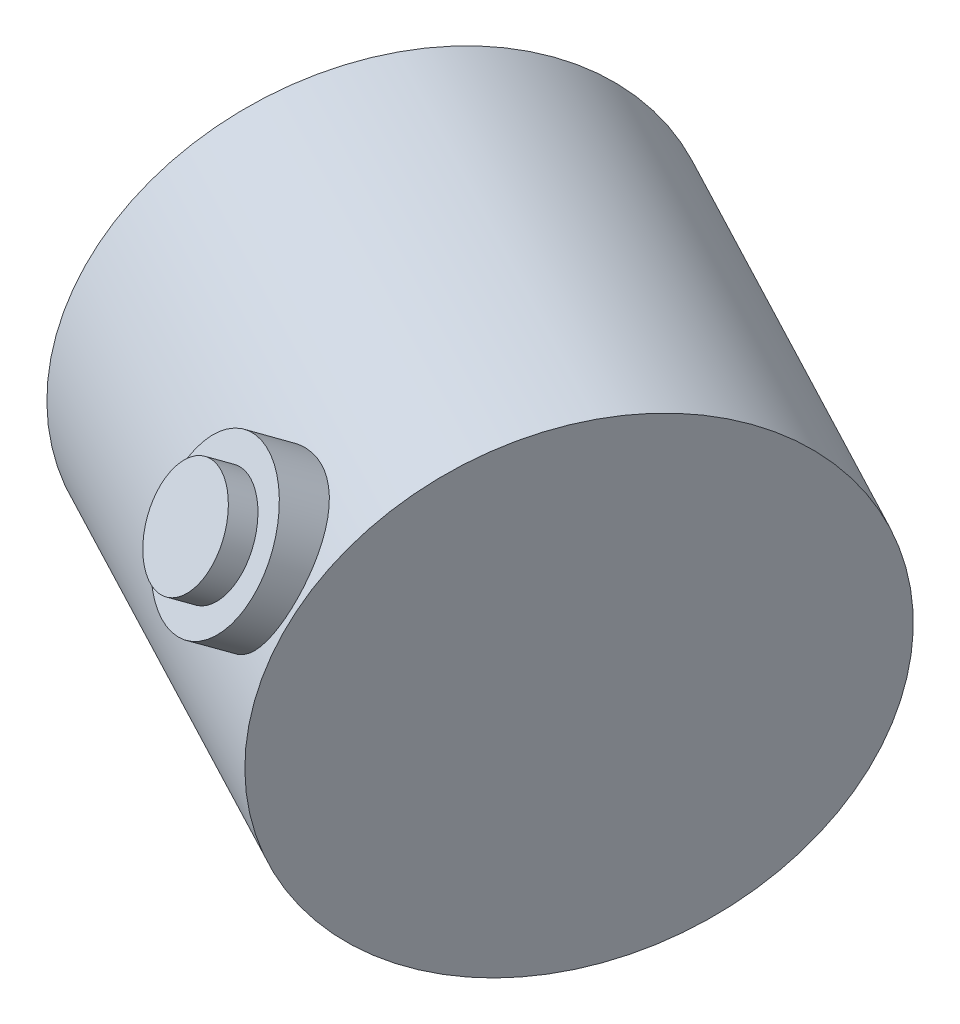
ISO-10303-21;
HEADER;
FILE_DESCRIPTION(('STEP AP214'),'2;1');
FILE_NAME('part.step','',(''),(''),'','','');
FILE_SCHEMA(('AUTOMOTIVE_DESIGN { 1 0 10303 214 1 1 1 1 }'));
ENDSEC;
DATA;
#1=APPLICATION_CONTEXT('core data for automotive mechanical design processes');
#2=APPLICATION_PROTOCOL_DEFINITION('international standard','automotive_design',2000,#1);
#3=PRODUCT_CONTEXT('',#1,'mechanical');
#4=PRODUCT('Part','Part','',(#3));
#5=PRODUCT_RELATED_PRODUCT_CATEGORY('part','',(#4));
#6=PRODUCT_DEFINITION_FORMATION('','',#4);
#7=PRODUCT_DEFINITION_CONTEXT('part definition',#1,'design');
#8=PRODUCT_DEFINITION('design','',#6,#7);
#9=PRODUCT_DEFINITION_SHAPE('','',#8);
#10=(LENGTH_UNIT() NAMED_UNIT(*) SI_UNIT(.MILLI.,.METRE.));
#11=(NAMED_UNIT(*) PLANE_ANGLE_UNIT() SI_UNIT($,.RADIAN.));
#12=(NAMED_UNIT(*) SI_UNIT($,.STERADIAN.) SOLID_ANGLE_UNIT());
#13=UNCERTAINTY_MEASURE_WITH_UNIT(LENGTH_MEASURE(1.E-05),#10,'distance_accuracy_value','');
#14=(GEOMETRIC_REPRESENTATION_CONTEXT(3) GLOBAL_UNCERTAINTY_ASSIGNED_CONTEXT((#13)) GLOBAL_UNIT_ASSIGNED_CONTEXT((#10,
#11,#12)) REPRESENTATION_CONTEXT('',''));
#15=CARTESIAN_POINT('',(0.,0.,0.));
#16=DIRECTION('',(0.,0.,1.));
#17=DIRECTION('',(1.,0.,0.));
#18=AXIS2_PLACEMENT_3D('',#15,#16,#17);
#19=CARTESIAN_POINT('',(51.9242983948159,113.432405259363,22.5851314132206));
#20=DIRECTION('',(-0.351191825080246,0.49477611999097,0.794896781402144));
#21=DIRECTION('',(0.815460169920325,0.5788131920348,0.));
#22=AXIS2_PLACEMENT_3D('',#19,#20,#21);
#23=PLANE('',#22);
#24=CARTESIAN_POINT('',(51.9242983948159,113.432405259363,22.5851314132206));
#25=DIRECTION('',(-0.351191825080246,0.494776119990969,0.794896781402144));
#26=DIRECTION('',(0.271168006367878,0.866336498762443,-0.419438890941818));
#27=AXIS2_PLACEMENT_3D('',#24,#25,#26);
#28=CIRCLE('',#27,4.);
#29=CARTESIAN_POINT('',(53.0089704202874,116.897751254413,20.9073758494534));
#30=VERTEX_POINT('',#29);
#31=EDGE_CURVE('E140',#30,#30,#28,.T.);
#32=ORIENTED_EDGE('',*,*,#31,.T.);
#33=EDGE_LOOP('',(#32));
#34=FACE_BOUND('',#33,.T.);
#35=ADVANCED_FACE('F17',(#34),#23,.T.);
#36=CARTESIAN_POINT('',(52.6266820449764,112.442853019381,20.9953378504164));
#37=DIRECTION('',(0.351191825080246,-0.49477611999097,-0.794896781402144));
#38=DIRECTION('',(0.,-0.848973388606735,0.52843560197776));
#39=AXIS2_PLACEMENT_3D('',#36,#37,#38);
#40=PLANE('',#39);
#41=CARTESIAN_POINT('',(52.6266820449764,112.442853019381,20.9953378504164));
#42=DIRECTION('',(-0.351191825080246,0.494776119990969,0.794896781402144));
#43=DIRECTION('',(0.271168006367878,0.866336498762443,-0.419438890941818));
#44=AXIS2_PLACEMENT_3D('',#41,#42,#43);
#45=CIRCLE('',#44,4.);
#46=CARTESIAN_POINT('',(53.7113540704479,115.908199014431,19.3175822866491));
#47=VERTEX_POINT('',#46);
#48=EDGE_CURVE('E137',#47,#47,#45,.T.);
#49=ORIENTED_EDGE('',*,*,#48,.F.);
#50=EDGE_LOOP('',(#49));
#51=FACE_BOUND('',#50,.T.);
#52=CARTESIAN_POINT('',(52.6266820449764,112.442853019381,20.9953378504164));
#53=DIRECTION('',(0.351191825080246,-0.494776119990969,-0.794896781402144));
#54=DIRECTION('',(-0.271168006367878,-0.866336498762443,0.419438890941818));
#55=AXIS2_PLACEMENT_3D('',#52,#53,#54);
#56=CIRCLE('',#55,6.);
#57=CARTESIAN_POINT('',(50.9996740067691,107.244834026807,23.5119711960673));
#58=VERTEX_POINT('',#57);
#59=EDGE_CURVE('E144',#58,#58,#56,.T.);
#60=ORIENTED_EDGE('',*,*,#59,.F.);
#61=EDGE_LOOP('',(#60));
#62=FACE_BOUND('',#61,.T.);
#63=ADVANCED_FACE('F334',(#51,#62),#40,.F.);
#64=CARTESIAN_POINT('',(37.0523147174565,103.332202091981,-7.89125284538117));
#65=DIRECTION('',(-0.896176441510976,0.0682470658615711,-0.438417750190398));
#66=DIRECTION('',(-0.439442331545378,0.,0.898270803959453));
#67=AXIS2_PLACEMENT_3D('',#64,#65,#66);
#68=PLANE('',#67);
#69=CARTESIAN_POINT('',(37.0523147174565,103.332202091981,-7.89125284538117));
#70=DIRECTION('',(-0.896176441510976,0.0682470658615709,-0.438417750190398));
#71=DIRECTION('',(0.271168006367878,0.866336498762443,-0.419438890941818));
#72=AXIS2_PLACEMENT_3D('',#69,#70,#71);
#73=CIRCLE('',#72,3.);
#74=CARTESIAN_POINT('',(36.2388106983528,100.733192595693,-6.63293617255571));
#75=VERTEX_POINT('',#74);
#76=EDGE_CURVE('E170',#75,#75,#73,.T.);
#77=ORIENTED_EDGE('',*,*,#76,.T.);
#78=EDGE_LOOP('',(#77));
#79=FACE_BOUND('',#78,.T.);
#80=ADVANCED_FACE('F336',(#79),#68,.T.);
#81=CARTESIAN_POINT('',(34.7771475049602,90.200660478821,-0.722833980873106));
#82=DIRECTION('',(-0.896176441510976,0.0682470658615711,-0.438417750190398));
#83=DIRECTION('',(-0.439442331545378,0.,0.898270803959453));
#84=AXIS2_PLACEMENT_3D('',#81,#82,#83);
#85=PLANE('',#84);
#86=CARTESIAN_POINT('',(34.7771475049602,90.200660478821,-0.722833980873106));
#87=DIRECTION('',(-0.896176441510976,0.0682470658615709,-0.438417750190398));
#88=DIRECTION('',(0.271168006367878,0.866336498762443,-0.419438890941818));
#89=AXIS2_PLACEMENT_3D('',#86,#87,#88);
#90=CIRCLE('',#89,1.5);
#91=CARTESIAN_POINT('',(34.3703954954084,88.9011557306774,-0.0936756444603783));
#92=VERTEX_POINT('',#91);
#93=EDGE_CURVE('E151',#92,#92,#90,.T.);
#94=ORIENTED_EDGE('',*,*,#93,.T.);
#95=EDGE_LOOP('',(#94));
#96=FACE_BOUND('',#95,.T.);
#97=ADVANCED_FACE('F331',(#96),#85,.T.);
#98=CARTESIAN_POINT('',(39.733304645499,118.160570102499,-6.50136250784601));
#99=DIRECTION('',(-0.896176441510976,0.0682470658615711,-0.438417750190398));
#100=DIRECTION('',(-0.439442331545378,0.,0.898270803959453));
#101=AXIS2_PLACEMENT_3D('',#98,#99,#100);
#102=PLANE('',#101);
#103=CARTESIAN_POINT('',(39.733304645499,118.160570102499,-6.50136250784601));
#104=DIRECTION('',(-0.896176441510976,0.0682470658615709,-0.438417750190398));
#105=DIRECTION('',(0.271168006367878,0.866336498762443,-0.419438890941818));
#106=AXIS2_PLACEMENT_3D('',#103,#104,#105);
#107=CIRCLE('',#106,1.5);
#108=CARTESIAN_POINT('',(39.3265526359472,116.861065354355,-5.87220417143328));
#109=VERTEX_POINT('',#108);
#110=EDGE_CURVE('E148',#109,#109,#107,.T.);
#111=ORIENTED_EDGE('',*,*,#110,.T.);
#112=EDGE_LOOP('',(#111));
#113=FACE_BOUND('',#112,.T.);
#114=ADVANCED_FACE('F326',(#113),#102,.T.);
#115=CARTESIAN_POINT('',(36.3163120164237,116.120562037447,0.165803064147189));
#116=DIRECTION('',(-0.896176441510976,0.0682470658615711,-0.438417750190398));
#117=DIRECTION('',(-0.439442331545378,0.,0.898270803959453));
#118=AXIS2_PLACEMENT_3D('',#115,#116,#117);
#119=PLANE('',#118);
#120=CARTESIAN_POINT('',(36.3163120164237,116.120562037447,0.165803064147189));
#121=DIRECTION('',(-0.896176441510976,0.0682470658615709,-0.438417750190398));
#122=DIRECTION('',(0.271168006367878,0.866336498762443,-0.419438890941818));
#123=AXIS2_PLACEMENT_3D('',#120,#121,#122);
#124=CIRCLE('',#123,1.5);
#125=CARTESIAN_POINT('',(35.9095600068719,114.821057289303,0.794961400559919));
#126=VERTEX_POINT('',#125);
#127=EDGE_CURVE('E185',#126,#126,#124,.T.);
#128=ORIENTED_EDGE('',*,*,#127,.T.);
#129=EDGE_LOOP('',(#128));
#130=FACE_BOUND('',#129,.T.);
#131=ADVANCED_FACE('F324',(#130),#119,.T.);
#132=CARTESIAN_POINT('',(45.4405432800512,103.265901364505,-20.4862211182751));
#133=DIRECTION('',(-0.896176441510976,0.0682470658615711,-0.438417750190398));
#134=DIRECTION('',(-0.439442331545378,0.,0.898270803959453));
#135=AXIS2_PLACEMENT_3D('',#132,#133,#134);
#136=PLANE('',#135);
#137=CARTESIAN_POINT('',(45.4405432800512,103.265901364505,-20.4862211182751));
#138=DIRECTION('',(-0.896176441510976,0.0682470658615709,-0.438417750190398));
#139=DIRECTION('',(0.271168006367878,0.866336498762443,-0.419438890941818));
#140=AXIS2_PLACEMENT_3D('',#137,#138,#139);
#141=CIRCLE('',#140,1.5);
#142=CARTESIAN_POINT('',(45.0337912704994,101.966396616361,-19.8570627818624));
#143=VERTEX_POINT('',#142);
#144=EDGE_CURVE('E205',#143,#143,#141,.T.);
#145=ORIENTED_EDGE('',*,*,#144,.T.);
#146=EDGE_LOOP('',(#145));
#147=FACE_BOUND('',#146,.T.);
#148=ADVANCED_FACE('F310',(#147),#136,.T.);
#149=CARTESIAN_POINT('',(32.6881531792541,95.6524876178808,4.39597953887744));
#150=DIRECTION('',(-0.896176441510976,0.0682470658615711,-0.438417750190398));
#151=DIRECTION('',(-0.439442331545378,0.,0.898270803959453));
#152=AXIS2_PLACEMENT_3D('',#149,#150,#151);
#153=PLANE('',#152);
#154=CARTESIAN_POINT('',(32.6881531792541,95.6524876178808,4.39597953887744));
#155=DIRECTION('',(-0.896176441510976,0.0682470658615709,-0.438417750190398));
#156=DIRECTION('',(0.271168006367878,0.866336498762443,-0.419438890941818));
#157=AXIS2_PLACEMENT_3D('',#154,#155,#156);
#158=CIRCLE('',#157,1.5);
#159=CARTESIAN_POINT('',(32.2814011697023,94.3529828697371,5.02513787529017));
#160=VERTEX_POINT('',#159);
#161=EDGE_CURVE('E211',#160,#160,#158,.T.);
#162=ORIENTED_EDGE('',*,*,#161,.T.);
#163=EDGE_LOOP('',(#162));
#164=FACE_BOUND('',#163,.T.);
#165=ADVANCED_FACE('F302',(#164),#153,.T.);
#166=CARTESIAN_POINT('',(44.1125449766821,95.7740661603931,-18.9378690660325));
#167=DIRECTION('',(-0.896176441510976,0.0682470658615711,-0.438417750190398));
#168=DIRECTION('',(-0.439442331545378,0.,0.898270803959453));
#169=AXIS2_PLACEMENT_3D('',#166,#167,#168);
#170=PLANE('',#169);
#171=CARTESIAN_POINT('',(44.1125449766821,95.7740661603931,-18.9378690660325));
#172=DIRECTION('',(-0.896176441510976,0.0682470658615709,-0.438417750190398));
#173=DIRECTION('',(0.271168006367878,0.866336498762443,-0.419438890941818));
#174=AXIS2_PLACEMENT_3D('',#171,#172,#173);
#175=CIRCLE('',#174,1.5);
#176=CARTESIAN_POINT('',(43.7057929671303,94.4745614122495,-18.3087107296198));
#177=VERTEX_POINT('',#176);
#178=EDGE_CURVE('E195',#177,#177,#175,.T.);
#179=ORIENTED_EDGE('',*,*,#178,.T.);
#180=EDGE_LOOP('',(#179));
#181=FACE_BOUND('',#180,.T.);
#182=ADVANCED_FACE('F306',(#181),#170,.T.);
#183=CARTESIAN_POINT('',(31.6752560683906,103.74168448715,-10.5217593465236));
#184=DIRECTION('',(-0.896176441510976,0.0682470658615711,-0.438417750190398));
#185=DIRECTION('',(-0.439442331545378,0.,0.898270803959453));
#186=AXIS2_PLACEMENT_3D('',#183,#184,#185);
#187=PLANE('',#186);
#188=CARTESIAN_POINT('',(31.6752560683906,103.74168448715,-10.5217593465236));
#189=DIRECTION('',(-0.896176441510976,0.0682470658615709,-0.438417750190398));
#190=DIRECTION('',(0.271168006367878,0.866336498762443,-0.419438890941818));
#191=AXIS2_PLACEMENT_3D('',#188,#189,#190);
#192=CIRCLE('',#191,3.);
#193=CARTESIAN_POINT('',(30.861752049287,101.142674990863,-9.2634426736981));
#194=VERTEX_POINT('',#193);
#195=EDGE_CURVE('E153',#194,#194,#192,.T.);
#196=ORIENTED_EDGE('',*,*,#195,.F.);
#197=EDGE_LOOP('',(#196));
#198=FACE_BOUND('',#197,.T.);
#199=CARTESIAN_POINT('',(31.6752560683906,103.74168448715,-10.5217593465236));
#200=DIRECTION('',(-0.896176441510976,0.0682470658615708,-0.438417750190398));
#201=DIRECTION('',(0.271168006367878,0.866336498762443,-0.419438890941818));
#202=AXIS2_PLACEMENT_3D('',#199,#200,#201);
#203=CIRCLE('',#202,10.);
#204=CARTESIAN_POINT('',(34.3869361320694,112.405049474775,-14.7161482559417));
#205=VERTEX_POINT('',#204);
#206=EDGE_CURVE('E240',#205,#205,#203,.T.);
#207=ORIENTED_EDGE('',*,*,#206,.T.);
#208=EDGE_LOOP('',(#207));
#209=FACE_BOUND('',#208,.T.);
#210=ADVANCED_FACE('F314',(#198,#209),#187,.T.);
#211=CARTESIAN_POINT('',(66.1780490665632,101.11417245148,6.35732403580678));
#212=DIRECTION('',(-0.896176441510976,0.0682470658615711,-0.438417750190398));
#213=DIRECTION('',(-0.439442331545378,0.,0.898270803959453));
#214=AXIS2_PLACEMENT_3D('',#211,#212,#213);
#215=PLANE('',#214);
#216=CARTESIAN_POINT('',(66.1780490665632,101.11417245148,6.35732403580678));
#217=DIRECTION('',(-0.896176441510976,0.0682470658615708,-0.438417750190398));
#218=DIRECTION('',(0.271168006367878,0.866336498762443,-0.419438890941818));
#219=AXIS2_PLACEMENT_3D('',#216,#217,#218);
#220=CIRCLE('',#219,19.35);
#221=CARTESIAN_POINT('',(71.4251499897816,117.877783702533,-1.75881850391739));
#222=VERTEX_POINT('',#221);
#223=EDGE_CURVE('E239',#222,#222,#220,.T.);
#224=ORIENTED_EDGE('',*,*,#223,.F.);
#225=EDGE_LOOP('',(#224));
#226=FACE_BOUND('',#225,.T.);
#227=ADVANCED_FACE('F315',(#226),#215,.F.);
#228=CARTESIAN_POINT('',(36.1561382759455,103.400449157842,-8.32967059557157));
#229=DIRECTION('',(-0.896176441510976,0.0682470658615711,-0.438417750190398));
#230=DIRECTION('',(-0.439442331545378,0.,0.898270803959453));
#231=AXIS2_PLACEMENT_3D('',#228,#229,#230);
#232=PLANE('',#231);
#233=CARTESIAN_POINT('',(36.1561382759455,103.400449157842,-8.32967059557157));
#234=DIRECTION('',(-0.896176441510976,0.0682470658615708,-0.438417750190398));
#235=DIRECTION('',(0.271168006367878,0.866336498762443,-0.419438890941818));
#236=AXIS2_PLACEMENT_3D('',#233,#234,#235);
#237=CIRCLE('',#236,10.);
#238=CARTESIAN_POINT('',(38.8678183396243,112.063814145467,-12.5240595049897));
#239=VERTEX_POINT('',#238);
#240=EDGE_CURVE('E227',#239,#239,#237,.T.);
#241=ORIENTED_EDGE('',*,*,#240,.F.);
#242=EDGE_LOOP('',(#241));
#243=FACE_BOUND('',#242,.T.);
#244=CARTESIAN_POINT('',(41.4240156521492,95.9788073579779,-20.2531223166037));
#245=DIRECTION('',(-0.896176441510976,0.0682470658615709,-0.438417750190398));
#246=DIRECTION('',(0.271168006367878,0.866336498762443,-0.419438890941818));
#247=AXIS2_PLACEMENT_3D('',#244,#245,#246);
#248=CIRCLE('',#247,1.5);
#249=CARTESIAN_POINT('',(41.0172636425974,94.6793026098342,-19.623963980191));
#250=VERTEX_POINT('',#249);
#251=EDGE_CURVE('E189',#250,#250,#248,.T.);
#252=ORIENTED_EDGE('',*,*,#251,.F.);
#253=EDGE_LOOP('',(#252));
#254=FACE_BOUND('',#253,.T.);
#255=CARTESIAN_POINT('',(29.9996238547212,95.8572288154655,3.08072628830625));
#256=DIRECTION('',(-0.896176441510976,0.0682470658615709,-0.438417750190398));
#257=DIRECTION('',(0.271168006367878,0.866336498762443,-0.419438890941818));
#258=AXIS2_PLACEMENT_3D('',#255,#256,#257);
#259=CIRCLE('',#258,1.5);
#260=CARTESIAN_POINT('',(29.5928718451694,94.5577240673218,3.70988462471897));
#261=VERTEX_POINT('',#260);
#262=EDGE_CURVE('E221',#261,#261,#259,.T.);
#263=ORIENTED_EDGE('',*,*,#262,.F.);
#264=EDGE_LOOP('',(#263));
#265=FACE_BOUND('',#264,.T.);
#266=CARTESIAN_POINT('',(42.7520139555183,103.47064256209,-21.8014743688463));
#267=DIRECTION('',(-0.896176441510976,0.0682470658615709,-0.438417750190398));
#268=DIRECTION('',(0.271168006367878,0.866336498762443,-0.419438890941818));
#269=AXIS2_PLACEMENT_3D('',#266,#267,#268);
#270=CIRCLE('',#269,1.5);
#271=CARTESIAN_POINT('',(42.3452619459665,102.171137813946,-21.1723160324336));
#272=VERTEX_POINT('',#271);
#273=EDGE_CURVE('E208',#272,#272,#270,.T.);
#274=ORIENTED_EDGE('',*,*,#273,.F.);
#275=EDGE_LOOP('',(#274));
#276=FACE_BOUND('',#275,.T.);
#277=CARTESIAN_POINT('',(33.6277826918908,116.325303235032,-1.149450186424));
#278=DIRECTION('',(-0.896176441510976,0.0682470658615709,-0.438417750190398));
#279=DIRECTION('',(0.271168006367878,0.866336498762443,-0.419438890941818));
#280=AXIS2_PLACEMENT_3D('',#277,#278,#279);
#281=CIRCLE('',#280,1.5);
#282=CARTESIAN_POINT('',(33.221030682339,115.025798486888,-0.520291850011275));
#283=VERTEX_POINT('',#282);
#284=EDGE_CURVE('E196',#283,#283,#281,.T.);
#285=ORIENTED_EDGE('',*,*,#284,.F.);
#286=EDGE_LOOP('',(#285));
#287=FACE_BOUND('',#286,.T.);
#288=CARTESIAN_POINT('',(37.044775320966,118.365311300084,-7.8166157584172));
#289=DIRECTION('',(-0.896176441510976,0.0682470658615709,-0.438417750190398));
#290=DIRECTION('',(0.271168006367878,0.866336498762443,-0.419438890941818));
#291=AXIS2_PLACEMENT_3D('',#288,#289,#290);
#292=CIRCLE('',#291,1.5);
#293=CARTESIAN_POINT('',(36.6380233114142,117.06580655194,-7.18745742200448));
#294=VERTEX_POINT('',#293);
#295=EDGE_CURVE('E182',#294,#294,#292,.T.);
#296=ORIENTED_EDGE('',*,*,#295,.F.);
#297=EDGE_LOOP('',(#296));
#298=FACE_BOUND('',#297,.T.);
#299=CARTESIAN_POINT('',(32.0886181804273,90.4054016764057,-2.0380872314443));
#300=DIRECTION('',(-0.896176441510976,0.0682470658615709,-0.438417750190398));
#301=DIRECTION('',(0.271168006367878,0.866336498762443,-0.419438890941818));
#302=AXIS2_PLACEMENT_3D('',#299,#300,#301);
#303=CIRCLE('',#302,1.5);
#304=CARTESIAN_POINT('',(31.6818661708755,89.1058969282621,-1.40892889503157));
#305=VERTEX_POINT('',#304);
#306=EDGE_CURVE('E162',#305,#305,#303,.T.);
#307=ORIENTED_EDGE('',*,*,#306,.F.);
#308=EDGE_LOOP('',(#307));
#309=FACE_BOUND('',#308,.T.);
#310=CARTESIAN_POINT('',(36.1561382759455,103.400449157842,-8.32967059557157));
#311=DIRECTION('',(-0.896176441510976,0.0682470658615708,-0.438417750190398));
#312=DIRECTION('',(0.271168006367878,0.866336498762443,-0.419438890941818));
#313=AXIS2_PLACEMENT_3D('',#310,#311,#312);
#314=CIRCLE('',#313,19.35);
#315=CARTESIAN_POINT('',(41.4032391991639,120.164060408896,-16.4458131352957));
#316=VERTEX_POINT('',#315);
#317=EDGE_CURVE('E11',#316,#316,#314,.T.);
#318=ORIENTED_EDGE('',*,*,#317,.T.);
#319=EDGE_LOOP('',(#318));
#320=FACE_BOUND('',#319,.T.);
#321=ADVANCED_FACE('F296',(#243,#254,#265,#276,#287,#298,#309,#320),#232,.T.);
#322=CARTESIAN_POINT('',(36.1561382759455,103.400449157842,-8.32967059557157));
#323=DIRECTION('',(0.896176441510976,-0.0682470658615709,0.438417750190398));
#324=DIRECTION('',(-0.271168006367878,-0.866336498762443,0.419438890941818));
#325=AXIS2_PLACEMENT_3D('',#322,#323,#324);
#326=CYLINDRICAL_SURFACE('',#325,19.35);
#327=CARTESIAN_POINT('',(55.519292984447,115.857829104299,15.6141057273949));
#328=CARTESIAN_POINT('',(55.4356246935888,115.864203252426,15.5731738102623));
#329=CARTESIAN_POINT('',(55.3510991418492,115.869060452374,15.5337610836463));
#330=CARTESIAN_POINT('',(55.1792062117482,115.875760557276,15.4574089471055));
#331=CARTESIAN_POINT('',(55.0918150174966,115.877554312102,15.4205188208364));
#332=CARTESIAN_POINT('',(54.9143395649188,115.877944612245,15.3493909493824));
#333=CARTESIAN_POINT('',(54.8242345791071,115.876489911986,15.3152046520808));
#334=CARTESIAN_POINT('',(54.6414994360986,115.870210255495,15.2496666871016));
#335=CARTESIAN_POINT('',(54.5488518948998,115.865332210483,15.2183685787295));
#336=CARTESIAN_POINT('',(54.3612192876159,115.852040455315,15.1587949352181));
#337=CARTESIAN_POINT('',(54.2662204302345,115.843572024803,15.1305750585152));
#338=CARTESIAN_POINT('',(54.074094302557,115.822940136605,15.0773437019218));
#339=CARTESIAN_POINT('',(53.9769570943475,115.810720507992,15.0523898441669));
#340=CARTESIAN_POINT('',(53.7807797487187,115.782450813772,15.0058990738834));
#341=CARTESIAN_POINT('',(53.6817336916348,115.766343583378,14.9844220057333));
#342=CARTESIAN_POINT('',(53.4820015273152,115.730125026235,14.9450174994905));
#343=CARTESIAN_POINT('',(53.3813139994209,115.709955010338,14.9271508372152));
#344=CARTESIAN_POINT('',(53.2143662694648,115.67347713934,14.9010091156825));
#345=CARTESIAN_POINT('',(53.1480646145772,115.658194850123,14.8915401331637));
#346=CARTESIAN_POINT('',(53.0073048034219,115.624029179613,14.8733188086662));
#347=CARTESIAN_POINT('',(52.9328667023365,115.604934545389,14.8648053354929));
#348=CARTESIAN_POINT('',(52.7760701339849,115.562400006669,14.8490259972226));
#349=CARTESIAN_POINT('',(52.6937540652909,115.538712992938,14.8420051133404));
#350=CARTESIAN_POINT('',(52.5215105903549,115.486221689441,14.8298620903078));
#351=CARTESIAN_POINT('',(52.4316483975148,115.457142408966,14.8250012203943));
#352=CARTESIAN_POINT('',(52.2447389158094,115.393039809575,14.8178863335194));
#353=CARTESIAN_POINT('',(52.1477840321949,115.357716241296,14.815910591175));
#354=CARTESIAN_POINT('',(51.9472343707251,115.280268082731,14.8153525171296));
#355=CARTESIAN_POINT('',(51.8437622702437,115.237821787181,14.8170677446893));
#356=CARTESIAN_POINT('',(51.6870839461339,115.169700212077,14.8227184436484));
#357=CARTESIAN_POINT('',(51.6331570818597,115.145542227273,14.8252276534593));
#358=CARTESIAN_POINT('',(51.523943451738,115.095162088834,14.8314625852783));
#359=CARTESIAN_POINT('',(51.4686788560089,115.068896781897,14.8352293520276));
#360=CARTESIAN_POINT('',(51.3569109669383,115.014192045052,14.8440915378954));
#361=CARTESIAN_POINT('',(51.300432555058,114.985708628732,14.8492290618401));
#362=CARTESIAN_POINT('',(51.1863592220187,114.926481477683,14.8609785955631));
#363=CARTESIAN_POINT('',(51.12879165019,114.895693816396,14.8676348078026));
#364=CARTESIAN_POINT('',(51.0166401380834,114.833857403129,14.881951084134));
#365=CARTESIAN_POINT('',(50.9620233585274,114.802857874072,14.8895664292984));
#366=CARTESIAN_POINT('',(50.8553117010784,114.740450829303,14.9056392611445));
#367=CARTESIAN_POINT('',(50.803189718246,114.709081545351,14.9140657296599));
#368=CARTESIAN_POINT('',(50.6528717818978,114.616033698416,14.940088353098));
#369=CARTESIAN_POINT('',(50.5558981555589,114.552743693367,14.9590525531569));
#370=CARTESIAN_POINT('',(50.3716641212142,114.4260291849,14.9993480580837));
#371=CARTESIAN_POINT('',(50.284176291585,114.362863126367,15.0204556863204));
#372=CARTESIAN_POINT('',(50.1184919759844,114.237304435648,15.0642899089675));
#373=CARTESIAN_POINT('',(50.0400658184781,114.175143901488,15.0868130693768));
#374=CARTESIAN_POINT('',(49.8920396244548,114.052390046469,15.1327723470853));
#375=CARTESIAN_POINT('',(49.8222102849944,113.992004974724,15.1560266200245));
#376=CARTESIAN_POINT('',(49.6908757881271,113.873482513633,15.2027908561395));
#377=CARTESIAN_POINT('',(49.6291446052975,113.815532721663,15.2261418183059));
#378=CARTESIAN_POINT('',(49.5134819030128,113.702469926927,15.2725091090898));
#379=CARTESIAN_POINT('',(49.4593303236099,113.647526280578,15.2953894313851));
#380=CARTESIAN_POINT('',(49.3583186000501,113.540941463304,15.3402327291089));
#381=CARTESIAN_POINT('',(49.3112444606294,113.48945760285,15.3620883313938));
#382=CARTESIAN_POINT('',(49.2000771601118,113.363326508591,15.4160280174474));
#383=CARTESIAN_POINT('',(49.1370422936981,113.287945571865,15.4485878708693));
#384=CARTESIAN_POINT('',(49.0161664097145,113.135608454781,15.5152136749793));
#385=CARTESIAN_POINT('',(48.9582668373501,113.058687201874,15.5492534098755));
#386=CARTESIAN_POINT('',(48.8476691433844,112.903512207127,15.6186207792594));
#387=CARTESIAN_POINT('',(48.7949113622044,112.825290465469,15.6539248280979));
#388=CARTESIAN_POINT('',(48.6945698435033,112.667789980447,15.7256552839669));
#389=CARTESIAN_POINT('',(48.6469258407382,112.588539788525,15.7620600879674));
#390=CARTESIAN_POINT('',(48.556771469454,112.42923316113,15.8358129319199));
#391=CARTESIAN_POINT('',(48.5142004450259,112.349202080077,15.8731415859));
#392=CARTESIAN_POINT('',(48.4341344156437,112.188574263,15.9485678877097));
#393=CARTESIAN_POINT('',(48.3965786441664,112.10799974817,15.986648351505));
#394=CARTESIAN_POINT('',(48.3264710378674,111.946511190588,16.063404920022));
#395=CARTESIAN_POINT('',(48.2938585774859,111.865616363867,16.1020660772014));
#396=CARTESIAN_POINT('',(48.2335517295649,111.703699893169,16.1798138846353));
#397=CARTESIAN_POINT('',(48.2057971071192,111.622694581269,16.2188878230028));
#398=CARTESIAN_POINT('',(48.1547753741312,111.459691617583,16.29780798743));
#399=CARTESIAN_POINT('',(48.1315066812787,111.37769432658,16.3376539357031));
#400=CARTESIAN_POINT('',(48.0891918549509,111.211774863832,16.4186302275088));
#401=CARTESIAN_POINT('',(48.0702081108054,111.127841722847,16.4597706953738));
#402=CARTESIAN_POINT('',(48.0366716150364,110.958234813872,16.5433134568462));
#403=CARTESIAN_POINT('',(48.0221834599051,110.872552990201,16.5857253245662));
#404=CARTESIAN_POINT('',(47.997842498727,110.699647858533,16.6717771502333));
#405=CARTESIAN_POINT('',(47.9880563432698,110.612419582834,16.7154259780275));
#406=CARTESIAN_POINT('',(47.9733187068319,110.43663528301,16.8039052205099));
#407=CARTESIAN_POINT('',(47.9684357663067,110.348077538889,16.8487436288007));
#408=CARTESIAN_POINT('',(47.9636955634916,110.169864524968,16.9395475245729));
#409=CARTESIAN_POINT('',(47.9639085248642,110.080210958447,16.9855200280119));
#410=CARTESIAN_POINT('',(47.9695488942809,109.90004511171,17.0785084495722));
#411=CARTESIAN_POINT('',(47.9750480907473,109.809538014481,17.1255300174268));
#412=CARTESIAN_POINT('',(47.9914172972807,109.627941724892,17.220581962031));
#413=CARTESIAN_POINT('',(48.0023601307164,109.536861645474,17.2686173191045));
#414=CARTESIAN_POINT('',(48.0256468953692,109.382221234069,17.3506167188794));
#415=CARTESIAN_POINT('',(48.0366325612496,109.318444315256,17.3845648613305));
#416=CARTESIAN_POINT('',(48.0625005635652,109.185023733638,17.4559199324994));
#417=CARTESIAN_POINT('',(48.077663982416,109.115436382689,17.4933307340679));
#418=CARTESIAN_POINT('',(48.1126381035858,108.970765209561,17.571744037749));
#419=CARTESIAN_POINT('',(48.1327472562266,108.895761743752,17.6127616617165));
#420=CARTESIAN_POINT('',(48.1784342621261,108.740690144221,17.6984564822171));
#421=CARTESIAN_POINT('',(48.2043294963954,108.660725443902,17.7431518163872));
#422=CARTESIAN_POINT('',(48.2624514468769,108.496263660601,17.8362468169394));
#423=CARTESIAN_POINT('',(48.2950132758648,108.411895457345,17.884665178638));
#424=CARTESIAN_POINT('',(48.3673668663432,108.239264410638,17.9851994131746));
#425=CARTESIAN_POINT('',(48.4075102083447,108.151157953172,18.0373307299839));
#426=CARTESIAN_POINT('',(48.4959543393763,107.971793470293,18.1452250794458));
#427=CARTESIAN_POINT('',(48.5446218082007,107.880720844233,18.2009970145446));
#428=CARTESIAN_POINT('',(48.6232065663625,107.744535394567,18.2859606428464));
#429=CARTESIAN_POINT('',(48.6510123935869,107.698194858366,18.3151586548331));
#430=CARTESIAN_POINT('',(48.7090634304523,107.605086463684,18.3743815675059));
#431=CARTESIAN_POINT('',(48.7393568326026,107.558347603035,18.4044049529774));
#432=CARTESIAN_POINT('',(48.8027050136984,107.464264028077,18.4655778769392));
#433=CARTESIAN_POINT('',(48.83582043968,107.416960598039,18.4967280902684));
#434=CARTESIAN_POINT('',(48.9026046689095,107.325163423527,18.5580942051263));
#435=CARTESIAN_POINT('',(48.9362195023349,107.280628433191,18.5883071611612));
#436=CARTESIAN_POINT('',(49.0038197128822,107.194275801273,18.6477351831526));
#437=CARTESIAN_POINT('',(49.0377536704869,107.152417247876,18.6769492661931));
#438=CARTESIAN_POINT('',(49.1058058456067,107.071338110103,18.7343578073432));
#439=CARTESIAN_POINT('',(49.1398755847992,107.032076527276,18.7625519802494));
#440=CARTESIAN_POINT('',(49.2402073483302,106.920230376515,18.8440296771346));
#441=CARTESIAN_POINT('',(49.3081211417814,106.849103802249,18.8972988960093));
#442=CARTESIAN_POINT('',(49.4429032512453,106.716479202444,18.9995608349017));
#443=CARTESIAN_POINT('',(49.5094483526112,106.654661637454,19.048566571481));
#444=CARTESIAN_POINT('',(49.6403667042129,106.539889839503,19.1422828387137));
#445=CARTESIAN_POINT('',(49.7044569751103,106.486626584681,19.1870101822854));
#446=CARTESIAN_POINT('',(49.8294753562598,106.388210969991,19.2722167039196));
#447=CARTESIAN_POINT('',(49.890159365023,106.342761802173,19.3127115619127));
#448=CARTESIAN_POINT('',(50.0075187040338,106.25922997023,19.3895307893821));
#449=CARTESIAN_POINT('',(50.0639861532639,106.220865553907,19.4258663359646));
#450=CARTESIAN_POINT('',(50.1721663693654,106.150831894522,19.4945434561502));
#451=CARTESIAN_POINT('',(50.2237084908505,106.118892805544,19.5268792671728));
#452=CARTESIAN_POINT('',(50.3549184925482,106.041168733333,19.6083112843466));
#453=CARTESIAN_POINT('',(50.4353743914933,105.996744366544,19.6574452741399));
#454=CARTESIAN_POINT('',(50.5976588551049,105.913398065894,19.7547268492134));
#455=CARTESIAN_POINT('',(50.6794473501707,105.87440209189,19.8028779930244));
#456=CARTESIAN_POINT('',(50.8440520617277,105.801854307634,19.8981726908447));
#457=CARTESIAN_POINT('',(50.9268329576702,105.768227789989,19.9453203292238));
#458=CARTESIAN_POINT('',(51.0931106445411,105.706305598144,20.0385166377895));
#459=CARTESIAN_POINT('',(51.1765765017536,105.677935441008,20.0845710203625));
#460=CARTESIAN_POINT('',(51.3439201118488,105.626409168678,20.1755262047787));
#461=CARTESIAN_POINT('',(51.427771332405,105.603178914231,20.2204338138124));
#462=CARTESIAN_POINT('',(51.5955967956249,105.561800383214,20.3090489563821));
#463=CARTESIAN_POINT('',(51.6795488013591,105.543578621642,20.3527642888168));
#464=CARTESIAN_POINT('',(51.8473016790973,105.512075569654,20.4389624930607));
#465=CARTESIAN_POINT('',(51.9310844995309,105.498721680084,20.4814539538241));
#466=CARTESIAN_POINT('',(52.0982373761116,105.476800661244,20.5651860087346));
#467=CARTESIAN_POINT('',(52.1815934791596,105.468162102688,20.6064357755826));
#468=CARTESIAN_POINT('',(52.2652769080324,105.46179111915,20.6473724186968));
#469=B_SPLINE_CURVE_WITH_KNOTS('',3,(#327,#328,#329,#330,#331,#332,#333,#334,#335,#336,#337,
#338,#339,#340,#341,#342,#343,#344,#345,#346,#347,#348,#349,#350,#351,#352,#353,#354,#355,#356,
#357,#358,#359,#360,#361,#362,#363,#364,#365,#366,#367,#368,#369,#370,#371,#372,#373,#374,#375,
#376,#377,#378,#379,#380,#381,#382,#383,#384,#385,#386,#387,#388,#389,#390,#391,#392,#393,#394,
#395,#396,#397,#398,#399,#400,#401,#402,#403,#404,#405,#406,#407,#408,#409,#410,#411,#412,#413,
#414,#415,#416,#417,#418,#419,#420,#421,#422,#423,#424,#425,#426,#427,#428,#429,#430,#431,#432,
#433,#434,#435,#436,#437,#438,#439,#440,#441,#442,#443,#444,#445,#446,#447,#448,#449,#450,#451,
#452,#453,#454,#455,#456,#457,#458,#459,#460,#461,#462,#463,#464,#465,#466,#467,#468),
.UNSPECIFIED.,.F.,.F.,(4,2,2,2,2,2,2,2,2,2,2,2,2,2,2,2,2,2,2,2,2,2,2,2,2,2,2,2,2,2,2,2,2,2,2,2,
2,2,2,2,2,2,2,2,2,2,2,2,2,2,2,2,2,2,2,2,2,2,2,2,2,2,2,2,2,2,2,2,2,2,4),(0.,0.280055287492272,
0.564563002311946,0.853590583801822,1.14720235455002,1.44545966898014,1.74842105686323,
2.05614236150592,2.36867687246047,2.57472646617948,2.806621397816,3.06437492041521,
3.3479962720184,3.6574919794462,3.9928666599674,4.17027820981851,4.35416269585017,
4.54452051015341,4.74135199944346,4.93110368619355,5.11532428672787,5.46713814397201,
5.79684100528973,6.10443812693313,6.38993629776681,6.65334432994759,6.89467377358719,
7.11393999009084,7.424339162244,7.73055452637673,8.03263664037557,8.33063816736188,
8.62461396499782,8.91462117700366,9.20071932663561,9.48297041181346,9.76512175642274,
10.0511486141417,10.3411130317591,10.6350745612526,10.933090356896,11.2352152705783,
11.5415019450274,11.8520009046925,12.0711938401946,12.3124709256926,12.5758475379139,
12.8613352345455,13.1689428307222,13.4986771154794,13.8505433434807,14.0347979952427,
14.2245889715236,14.4213832462645,14.611708807898,14.7955660032367,14.972955224438,
15.3083001421773,15.617785928655,15.9014172008843,16.1592004828672,16.3911450054504,
16.5972640066057,16.9097525291178,17.2174409412112,17.5203825700244,17.8186332912396,
18.112251660961,18.4012990529823,18.685839801283,18.9659413475009),.UNSPECIFIED.);
#470=CARTESIAN_POINT('',(55.5192929844469,115.857829104299,15.614105727395));
#471=VERTEX_POINT('',#470);
#472=CARTESIAN_POINT('',(52.2652769080324,105.46179111915,20.6473724186968));
#473=VERTEX_POINT('',#472);
#474=EDGE_CURVE('E171',#471,#473,#469,.T.);
#475=ORIENTED_EDGE('',*,*,#474,.F.);
#476=CARTESIAN_POINT('',(52.2652769080324,105.46179111915,20.6473724186968));
#477=CARTESIAN_POINT('',(52.3489446743156,105.455417710081,20.6883055231877));
#478=CARTESIAN_POINT('',(52.432937215352,105.451311441539,20.7289246802206));
#479=CARTESIAN_POINT('',(52.6027297541456,105.447570470063,20.8100308975339));
#480=CARTESIAN_POINT('',(52.6885372577029,105.448007895704,20.8505055908433));
#481=CARTESIAN_POINT('',(52.8618112457136,105.453536823155,20.9311431673408));
#482=CARTESIAN_POINT('',(52.9492824292629,105.458702152117,20.9712908817227));
#483=CARTESIAN_POINT('',(53.1257156829977,105.473860216657,21.0510927080645));
#484=CARTESIAN_POINT('',(53.214679395238,105.483928219035,21.0907288914549));
#485=CARTESIAN_POINT('',(53.3939088971692,105.50905867763,21.1693223438612));
#486=CARTESIAN_POINT('',(53.4841730174438,105.524197636005,21.2082589486228));
#487=CARTESIAN_POINT('',(53.6657974378442,105.559624840059,21.2852601446972));
#488=CARTESIAN_POINT('',(53.7571525734188,105.57999053375,21.3233012971887));
#489=CARTESIAN_POINT('',(53.940719781803,105.626026002479,21.3983341825906));
#490=CARTESIAN_POINT('',(54.0329227676601,105.651774084354,21.4353000374926));
#491=CARTESIAN_POINT('',(54.2179739119305,105.70867597639,21.5079339492583));
#492=CARTESIAN_POINT('',(54.3108096038684,105.739908040567,21.543572662808));
#493=CARTESIAN_POINT('',(54.4638485024519,105.795981349851,21.6011959982971));
#494=CARTESIAN_POINT('',(54.524393123537,105.819374428572,21.6236956025129));
#495=CARTESIAN_POINT('',(54.6524782359954,105.871396831518,21.6706051730805));
#496=CARTESIAN_POINT('',(54.7199436685776,105.900314900433,21.6949007672383));
#497=CARTESIAN_POINT('',(54.8616546842904,105.964102699669,21.7448251412693));
#498=CARTESIAN_POINT('',(54.9358174248968,105.999276518628,21.7703004818304));
#499=CARTESIAN_POINT('',(55.0905950017977,106.076374628786,21.8219762764799));
#500=CARTESIAN_POINT('',(55.1711104039788,106.118622122494,21.8479929173886));
#501=CARTESIAN_POINT('',(55.3381641700127,106.210698419634,21.9000497514656));
#502=CARTESIAN_POINT('',(55.4245818988235,106.260867243931,21.9258755660694));
#503=CARTESIAN_POINT('',(55.6028882703668,106.369652830741,21.9767796851932));
#504=CARTESIAN_POINT('',(55.6946301625625,106.428625213959,22.0016149182849));
#505=CARTESIAN_POINT('',(55.8331793040005,106.52228806288,22.036998286164));
#506=CARTESIAN_POINT('',(55.8807984520905,106.555332664843,22.0487661263306));
#507=CARTESIAN_POINT('',(55.9770993403155,106.623904901693,22.0717582326189));
#508=CARTESIAN_POINT('',(56.0257564596136,106.659479142573,22.0829470010209));
#509=CARTESIAN_POINT('',(56.1240175850178,106.733212864526,22.1046563776546));
#510=CARTESIAN_POINT('',(56.1735946254109,106.771419268408,22.1151395986112));
#511=CARTESIAN_POINT('',(56.2735520778016,106.850533558133,22.1353403186898));
#512=CARTESIAN_POINT('',(56.3239024730122,106.891489128579,22.1450196529423));
#513=CARTESIAN_POINT('',(56.4218858702774,106.973286270518,22.1627718585949));
#514=CARTESIAN_POINT('',(56.469551472602,107.014078955814,22.1708899899001));
#515=CARTESIAN_POINT('',(56.5626544546583,107.095658563743,22.1856193901394));
#516=CARTESIAN_POINT('',(56.608116285053,107.136410994088,22.1922676849969));
#517=CARTESIAN_POINT('',(56.7391623047351,107.256610053784,22.2098656223267));
#518=CARTESIAN_POINT('',(56.8236218822458,107.337530458997,22.2192260480784));
#519=CARTESIAN_POINT('',(56.9839489254754,107.497926298516,22.2330422530111));
#520=CARTESIAN_POINT('',(57.0600227826499,107.577172916261,22.2377693090474));
#521=CARTESIAN_POINT('',(57.2039983736865,107.733315913496,22.2430711824252));
#522=CARTESIAN_POINT('',(57.2721060481405,107.810013628263,22.2439031469977));
#523=CARTESIAN_POINT('',(57.4006180611915,107.960260010341,22.2421127780745));
#524=CARTESIAN_POINT('',(57.4612242967649,108.033639039393,22.2397343203157));
#525=CARTESIAN_POINT('',(57.5752420453386,108.17655817779,22.2321652664661));
#526=CARTESIAN_POINT('',(57.6288474092559,108.245956018765,22.2272064959978));
#527=CARTESIAN_POINT('',(57.729383412526,108.380330043136,22.2150773726985));
#528=CARTESIAN_POINT('',(57.776496909529,108.445189282521,22.2081272308397));
#529=CARTESIAN_POINT('',(57.8645955471953,108.569966683861,22.1925117507657));
#530=CARTESIAN_POINT('',(57.9057471765009,108.629794464985,22.1840613134221));
#531=CARTESIAN_POINT('',(58.003210356426,108.77523259102,22.1611398933159));
#532=CARTESIAN_POINT('',(58.0587140088821,108.861223868066,22.145626386883));
#533=CARTESIAN_POINT('',(58.1655151837709,109.033390119527,22.1108576481227));
#534=CARTESIAN_POINT('',(58.2168593159901,109.119546995197,22.0916556682284));
#535=CARTESIAN_POINT('',(58.3153731855714,109.291746269203,22.0496391436219));
#536=CARTESIAN_POINT('',(58.3625899138107,109.37777451564,22.0268768592279));
#537=CARTESIAN_POINT('',(58.4528663094206,109.549455235446,21.9779280667677));
#538=CARTESIAN_POINT('',(58.4959735155081,109.635097087123,21.9517919672851));
#539=CARTESIAN_POINT('',(58.578074172216,109.805750179242,21.8962681120245));
#540=CARTESIAN_POINT('',(58.6171153290561,109.890754309415,21.8669290528829));
#541=CARTESIAN_POINT('',(58.691140963427,110.059892128771,21.8051747395134));
#542=CARTESIAN_POINT('',(58.7261730899819,110.144022077329,21.7728063598088));
#543=CARTESIAN_POINT('',(58.7922531683933,110.311184812159,21.7051658035336));
#544=CARTESIAN_POINT('',(58.8233484587609,110.39421710184,21.6699386487571));
#545=CARTESIAN_POINT('',(58.8816406240602,110.558971955544,21.5967509268258));
#546=CARTESIAN_POINT('',(58.9088842972349,110.640697117712,21.5588334844516));
#547=CARTESIAN_POINT('',(58.9599047474875,110.803701888704,21.4799162234211));
#548=CARTESIAN_POINT('',(58.9836827462802,110.88498164477,21.4389174987366));
#549=CARTESIAN_POINT('',(59.0280096019952,111.048066462742,21.3533871268787));
#550=CARTESIAN_POINT('',(59.0485096186676,111.129863405285,21.3088146880314));
#551=CARTESIAN_POINT('',(59.086072060213,111.29379836612,21.2161594953572));
#552=CARTESIAN_POINT('',(59.1030832767907,111.375925578152,21.168036864223));
#553=CARTESIAN_POINT('',(59.133463799208,111.54032188228,21.0683149373351));
#554=CARTESIAN_POINT('',(59.1467796694064,111.622577324218,21.0166768606748));
#555=CARTESIAN_POINT('',(59.169571027337,111.787015149578,20.9099686138658));
#556=CARTESIAN_POINT('',(59.1789910163133,111.869180879217,20.8548609311908));
#557=CARTESIAN_POINT('',(59.1937971484627,112.033212522406,20.7412735471326));
#558=CARTESIAN_POINT('',(59.1991258810475,112.115058680997,20.682757828345));
#559=CARTESIAN_POINT('',(59.2055710149547,112.278197882951,20.5624147618137));
#560=CARTESIAN_POINT('',(59.206628380427,112.359467776885,20.5005528998312));
#561=CARTESIAN_POINT('',(59.2043361744019,112.521231703613,20.3736387033541));
#562=CARTESIAN_POINT('',(59.2009257953975,112.601699694936,20.3085541915201));
#563=CARTESIAN_POINT('',(59.1913421460631,112.737034491107,20.1955388014454));
#564=CARTESIAN_POINT('',(59.1862762421594,112.792471361364,20.1481917146252));
#565=CARTESIAN_POINT('',(59.1733166692211,112.907705919951,20.0476193661632));
#566=CARTESIAN_POINT('',(59.1651895208167,112.967380230938,19.9942824856882));
#567=CARTESIAN_POINT('',(59.1453391134907,113.090744380586,19.8816377717796));
#568=CARTESIAN_POINT('',(59.1333546548733,113.154301382385,19.8222305024469));
#569=CARTESIAN_POINT('',(59.1049828741724,113.284978450699,19.6973439474618));
#570=CARTESIAN_POINT('',(59.0883103877931,113.351949695337,19.6317736040145));
#571=CARTESIAN_POINT('',(59.0497026222127,113.488918946084,19.4945096859269));
#572=CARTESIAN_POINT('',(59.027459666331,113.558749419161,19.4227353163919));
#573=CARTESIAN_POINT('',(58.9768163116403,113.700794030051,19.2730615651503));
#574=CARTESIAN_POINT('',(58.9480880867852,113.772818315433,19.1950929729918));
#575=CARTESIAN_POINT('',(58.8835539714741,113.918497205562,19.0330800672237));
#576=CARTESIAN_POINT('',(58.8474024497282,113.9919367568,18.9489792094299));
#577=CARTESIAN_POINT('',(58.7880927272822,114.10096659891,18.8203879600238));
#578=CARTESIAN_POINT('',(58.7669482814139,114.137922257149,18.7761124028525));
#579=CARTESIAN_POINT('',(58.7225085667304,114.211854359294,18.6860812667356));
#580=CARTESIAN_POINT('',(58.699167761694,114.248798063059,18.6403211906923));
#581=CARTESIAN_POINT('',(58.649987718779,114.322920876022,18.547079731281));
#582=CARTESIAN_POINT('',(58.6240880697547,114.360058368611,18.4995971391507));
#583=CARTESIAN_POINT('',(58.5714171146931,114.431972076203,18.4062866694194));
#584=CARTESIAN_POINT('',(58.5447024440743,114.466785781647,18.3604557039324));
#585=CARTESIAN_POINT('',(58.4906067658985,114.534112571675,18.2704611692223));
#586=CARTESIAN_POINT('',(58.4632792607024,114.566663633666,18.226293868553));
#587=CARTESIAN_POINT('',(58.4081379675901,114.62955329304,18.1396624984997));
#588=CARTESIAN_POINT('',(58.3803751069078,114.659929438732,18.0971931713898));
#589=CARTESIAN_POINT('',(58.2981705593463,114.746237086145,17.9746858585696));
#590=CARTESIAN_POINT('',(58.2419858485737,114.800839158367,17.8948687264231));
#591=CARTESIAN_POINT('',(58.1294455418113,114.902128424941,17.7422641081661));
#592=CARTESIAN_POINT('',(58.0734372124218,114.949101273187,17.6694091656755));
#593=CARTESIAN_POINT('',(57.9623745726681,115.035899378747,17.5307509597981));
#594=CARTESIAN_POINT('',(57.9076314438028,115.075993925351,17.4648670499865));
#595=CARTESIAN_POINT('',(57.800080458795,115.14980062299,17.3401243662333));
#596=CARTESIAN_POINT('',(57.7475508843163,115.183761427284,17.281172548059));
#597=CARTESIAN_POINT('',(57.6452800382253,115.246035856763,17.1702016305426));
#598=CARTESIAN_POINT('',(57.5957870441736,115.274574321535,17.1180799195012));
#599=CARTESIAN_POINT('',(57.5002860949103,115.326744813374,17.0207042149036));
#600=CARTESIAN_POINT('',(57.4545036866983,115.350569338298,16.9753317181777));
#601=CARTESIAN_POINT('',(57.3372049878407,115.408694490707,16.8624124938334));
#602=CARTESIAN_POINT('',(57.2646011196399,115.442056534776,16.7955060118573));
#603=CARTESIAN_POINT('',(57.1169978266117,115.504719288432,16.6649946905025));
#604=CARTESIAN_POINT('',(57.0420523311799,115.534074511808,16.6013549219698));
#605=CARTESIAN_POINT('',(56.8900577181761,115.588856576053,16.4775181965827));
#606=CARTESIAN_POINT('',(56.8130588906999,115.614337034488,16.4172832728929));
#607=CARTESIAN_POINT('',(56.65728292137,115.661463896011,16.300317101602));
#608=CARTESIAN_POINT('',(56.5785517779234,115.683163558168,16.2435460437975));
#609=CARTESIAN_POINT('',(56.4196112706095,115.722851130696,16.1335710563064));
#610=CARTESIAN_POINT('',(56.3394438587653,115.740891456302,16.0803254180835));
#611=CARTESIAN_POINT('',(56.1779202857047,115.773391578032,15.9774464121583));
#612=CARTESIAN_POINT('',(56.0966020596056,115.787902742785,15.9277697138675));
#613=CARTESIAN_POINT('',(55.9330506456064,115.81348656836,15.8320618064781));
#614=CARTESIAN_POINT('',(55.8508514909151,115.824609312625,15.785985835166));
#615=CARTESIAN_POINT('',(55.6857990079977,115.843571194739,15.6974996941865));
#616=CARTESIAN_POINT('',(55.60297589301,115.851458853799,15.6550435481926));
#617=CARTESIAN_POINT('',(55.519292984447,115.857829104299,15.6141057273949));
#618=B_SPLINE_CURVE_WITH_KNOTS('',3,(#476,#477,#478,#479,#480,#481,#482,#483,#484,#485,#486,
#487,#488,#489,#490,#491,#492,#493,#494,#495,#496,#497,#498,#499,#500,#501,#502,#503,#504,#505,
#506,#507,#508,#509,#510,#511,#512,#513,#514,#515,#516,#517,#518,#519,#520,#521,#522,#523,#524,
#525,#526,#527,#528,#529,#530,#531,#532,#533,#534,#535,#536,#537,#538,#539,#540,#541,#542,#543,
#544,#545,#546,#547,#548,#549,#550,#551,#552,#553,#554,#555,#556,#557,#558,#559,#560,#561,#562,
#563,#564,#565,#566,#567,#568,#569,#570,#571,#572,#573,#574,#575,#576,#577,#578,#579,#580,#581,
#582,#583,#584,#585,#586,#587,#588,#589,#590,#591,#592,#593,#594,#595,#596,#597,#598,#599,#600,
#601,#602,#603,#604,#605,#606,#607,#608,#609,#610,#611,#612,#613,#614,#615,#616,#617),
.UNSPECIFIED.,.F.,.F.,(4,2,2,2,2,2,2,2,2,2,2,2,2,2,2,2,2,2,2,2,2,2,2,2,2,2,2,2,2,2,2,2,2,2,2,2,
2,2,2,2,2,2,2,2,2,2,2,2,2,2,2,2,2,2,2,2,2,2,2,2,2,2,2,2,2,2,2,2,2,2,4),(0.,0.280055287518428,
0.564563002356783,0.853590583857841,1.14720235460976,1.44545966903612,1.74842105690801,
2.05614236153205,2.36867687246056,2.5747264668291,2.80662139892952,3.06437492180708,
3.34799627350307,3.65749198083818,3.99286666108132,4.17027821072381,4.35416269650051,
4.54452051050245,4.74135199944487,4.9311036857634,5.11532428592369,5.46713814259251,
5.79684100356501,6.10443812509332,6.38993629604215,6.65334432856832,6.89467377278358,
7.11393999009314,7.4243391620379,7.73055452602164,8.03263663993101,8.33063816688749,
8.6246139645533,8.91462117664879,9.20071932643016,9.48297041181718,9.76512175651934,
10.0511486143045,10.3411130319617,10.6350745614683,10.9330903570984,11.2352152707411,
11.5415019451243,11.8520009046972,12.0711938400511,12.3124709254432,12.575847537601,
12.8613352342114,13.1689428304092,13.4986771152298,13.8505433433367,14.0347979951674,
14.2245889715274,14.4213832464757,14.611708808289,14.7955660037799,14.9729552251057,
15.308300143011,15.6177859295441,15.901417201718,16.159200483535,16.3911450058414,
16.5972640066091,16.9097525291202,17.2174409412128,17.5203825700255,17.8186332912405,
18.1122516609621,18.4012990529838,18.6858398012852,18.9659413475042),.UNSPECIFIED.);
#619=EDGE_CURVE('E280',#473,#471,#618,.T.);
#620=ORIENTED_EDGE('',*,*,#619,.F.);
#621=EDGE_LOOP('',(#475,#620));
#622=FACE_BOUND('',#621,.T.);
#623=ORIENTED_EDGE('',*,*,#223,.T.);
#624=DIRECTION('',(-0.896176441510976,0.0682470658615711,-0.438417750190398));
#625=VECTOR('',#624,1.);
#626=CARTESIAN_POINT('',(41.4032391991639,120.164060408896,-16.4458131352957));
#627=LINE('',#626,#625);
#628=EDGE_CURVE('E29',#222,#316,#627,.T.);
#629=ORIENTED_EDGE('',*,*,#628,.T.);
#630=ORIENTED_EDGE('',*,*,#317,.F.);
#631=ORIENTED_EDGE('',*,*,#628,.F.);
#632=EDGE_LOOP('',(#623,#629,#630,#631));
#633=FACE_BOUND('',#632,.T.);
#634=ADVANCED_FACE('F279',(#622,#633),#326,.T.);
#635=CARTESIAN_POINT('',(31.6752560683906,103.74168448715,-10.5217593465236));
#636=DIRECTION('',(0.896176441510976,-0.0682470658615708,0.438417750190398));
#637=DIRECTION('',(-0.271168006367878,-0.866336498762443,0.419438890941818));
#638=AXIS2_PLACEMENT_3D('',#635,#636,#637);
#639=CYLINDRICAL_SURFACE('',#638,10.);
#640=ORIENTED_EDGE('',*,*,#240,.T.);
#641=DIRECTION('',(-0.896176441510976,0.0682470658615711,-0.438417750190398));
#642=VECTOR('',#641,1.);
#643=CARTESIAN_POINT('',(34.3869361320694,112.405049474775,-14.7161482559417));
#644=LINE('',#643,#642);
#645=EDGE_CURVE('E232',#239,#205,#644,.T.);
#646=ORIENTED_EDGE('',*,*,#645,.T.);
#647=ORIENTED_EDGE('',*,*,#206,.F.);
#648=ORIENTED_EDGE('',*,*,#645,.F.);
#649=EDGE_LOOP('',(#640,#646,#647,#648));
#650=FACE_BOUND('',#649,.T.);
#651=ADVANCED_FACE('F299',(#650),#639,.T.);
#652=CARTESIAN_POINT('',(44.1125449766821,95.7740661603931,-18.9378690660325));
#653=DIRECTION('',(-0.896176441510976,0.0682470658615709,-0.438417750190398));
#654=DIRECTION('',(0.271168006367878,0.866336498762443,-0.419438890941818));
#655=AXIS2_PLACEMENT_3D('',#652,#653,#654);
#656=CYLINDRICAL_SURFACE('',#655,1.5);
#657=ORIENTED_EDGE('',*,*,#178,.F.);
#658=DIRECTION('',(-0.896176441510976,0.0682470658615711,-0.438417750190398));
#659=VECTOR('',#658,1.);
#660=CARTESIAN_POINT('',(43.7057929671303,94.4745614122495,-18.3087107296198));
#661=LINE('',#660,#659);
#662=EDGE_CURVE('E186',#177,#250,#661,.T.);
#663=ORIENTED_EDGE('',*,*,#662,.T.);
#664=ORIENTED_EDGE('',*,*,#251,.T.);
#665=ORIENTED_EDGE('',*,*,#662,.F.);
#666=EDGE_LOOP('',(#657,#663,#664,#665));
#667=FACE_BOUND('',#666,.T.);
#668=ADVANCED_FACE('F460',(#667),#656,.F.);
#669=CARTESIAN_POINT('',(32.6881531792541,95.6524876178808,4.39597953887744));
#670=DIRECTION('',(-0.896176441510976,0.0682470658615709,-0.438417750190398));
#671=DIRECTION('',(0.271168006367878,0.866336498762443,-0.419438890941818));
#672=AXIS2_PLACEMENT_3D('',#669,#670,#671);
#673=CYLINDRICAL_SURFACE('',#672,1.5);
#674=ORIENTED_EDGE('',*,*,#161,.F.);
#675=DIRECTION('',(-0.896176441510976,0.0682470658615711,-0.438417750190398));
#676=VECTOR('',#675,1.);
#677=CARTESIAN_POINT('',(32.2814011697023,94.3529828697371,5.02513787529017));
#678=LINE('',#677,#676);
#679=EDGE_CURVE('E220',#160,#261,#678,.T.);
#680=ORIENTED_EDGE('',*,*,#679,.T.);
#681=ORIENTED_EDGE('',*,*,#262,.T.);
#682=ORIENTED_EDGE('',*,*,#679,.F.);
#683=EDGE_LOOP('',(#674,#680,#681,#682));
#684=FACE_BOUND('',#683,.T.);
#685=ADVANCED_FACE('F438',(#684),#673,.F.);
#686=CARTESIAN_POINT('',(45.4405432800512,103.265901364505,-20.4862211182751));
#687=DIRECTION('',(-0.896176441510976,0.0682470658615709,-0.438417750190398));
#688=DIRECTION('',(0.271168006367878,0.866336498762443,-0.419438890941818));
#689=AXIS2_PLACEMENT_3D('',#686,#687,#688);
#690=CYLINDRICAL_SURFACE('',#689,1.5);
#691=ORIENTED_EDGE('',*,*,#144,.F.);
#692=DIRECTION('',(-0.896176441510976,0.0682470658615711,-0.438417750190399));
#693=VECTOR('',#692,1.);
#694=CARTESIAN_POINT('',(45.0337912704994,101.966396616361,-19.8570627818624));
#695=LINE('',#694,#693);
#696=EDGE_CURVE('E207',#143,#272,#695,.T.);
#697=ORIENTED_EDGE('',*,*,#696,.T.);
#698=ORIENTED_EDGE('',*,*,#273,.T.);
#699=ORIENTED_EDGE('',*,*,#696,.F.);
#700=EDGE_LOOP('',(#691,#697,#698,#699));
#701=FACE_BOUND('',#700,.T.);
#702=ADVANCED_FACE('F298',(#701),#690,.F.);
#703=CARTESIAN_POINT('',(36.3163120164237,116.120562037447,0.165803064147189));
#704=DIRECTION('',(-0.896176441510976,0.0682470658615709,-0.438417750190398));
#705=DIRECTION('',(0.271168006367878,0.866336498762443,-0.419438890941818));
#706=AXIS2_PLACEMENT_3D('',#703,#704,#705);
#707=CYLINDRICAL_SURFACE('',#706,1.5);
#708=ORIENTED_EDGE('',*,*,#127,.F.);
#709=DIRECTION('',(-0.896176441510976,0.0682470658615711,-0.438417750190398));
#710=VECTOR('',#709,1.);
#711=CARTESIAN_POINT('',(35.9095600068719,114.821057289303,0.794961400559918));
#712=LINE('',#711,#710);
#713=EDGE_CURVE('E194',#126,#283,#712,.T.);
#714=ORIENTED_EDGE('',*,*,#713,.T.);
#715=ORIENTED_EDGE('',*,*,#284,.T.);
#716=ORIENTED_EDGE('',*,*,#713,.F.);
#717=EDGE_LOOP('',(#708,#714,#715,#716));
#718=FACE_BOUND('',#717,.T.);
#719=ADVANCED_FACE('F436',(#718),#707,.F.);
#720=CARTESIAN_POINT('',(39.733304645499,118.160570102499,-6.50136250784601));
#721=DIRECTION('',(-0.896176441510976,0.0682470658615709,-0.438417750190398));
#722=DIRECTION('',(0.271168006367878,0.866336498762443,-0.419438890941818));
#723=AXIS2_PLACEMENT_3D('',#720,#721,#722);
#724=CYLINDRICAL_SURFACE('',#723,1.5);
#725=ORIENTED_EDGE('',*,*,#110,.F.);
#726=DIRECTION('',(-0.896176441510976,0.0682470658615711,-0.438417750190398));
#727=VECTOR('',#726,1.);
#728=CARTESIAN_POINT('',(39.3265526359472,116.861065354355,-5.87220417143328));
#729=LINE('',#728,#727);
#730=EDGE_CURVE('E179',#109,#294,#729,.T.);
#731=ORIENTED_EDGE('',*,*,#730,.T.);
#732=ORIENTED_EDGE('',*,*,#295,.T.);
#733=ORIENTED_EDGE('',*,*,#730,.F.);
#734=EDGE_LOOP('',(#725,#731,#732,#733));
#735=FACE_BOUND('',#734,.T.);
#736=ADVANCED_FACE('F446',(#735),#724,.F.);
#737=CARTESIAN_POINT('',(34.7771475049602,90.200660478821,-0.722833980873106));
#738=DIRECTION('',(-0.896176441510976,0.0682470658615709,-0.438417750190398));
#739=DIRECTION('',(0.271168006367878,0.866336498762443,-0.419438890941818));
#740=AXIS2_PLACEMENT_3D('',#737,#738,#739);
#741=CYLINDRICAL_SURFACE('',#740,1.5);
#742=ORIENTED_EDGE('',*,*,#93,.F.);
#743=DIRECTION('',(-0.896176441510976,0.0682470658615711,-0.438417750190399));
#744=VECTOR('',#743,1.);
#745=CARTESIAN_POINT('',(34.3703954954084,88.9011557306774,-0.0936756444603788));
#746=LINE('',#745,#744);
#747=EDGE_CURVE('E163',#92,#305,#746,.T.);
#748=ORIENTED_EDGE('',*,*,#747,.T.);
#749=ORIENTED_EDGE('',*,*,#306,.T.);
#750=ORIENTED_EDGE('',*,*,#747,.F.);
#751=EDGE_LOOP('',(#742,#748,#749,#750));
#752=FACE_BOUND('',#751,.T.);
#753=ADVANCED_FACE('F466',(#752),#741,.F.);
#754=CARTESIAN_POINT('',(37.0523147174565,103.332202091981,-7.89125284538117));
#755=DIRECTION('',(-0.896176441510976,0.0682470658615709,-0.438417750190398));
#756=DIRECTION('',(0.271168006367878,0.866336498762443,-0.419438890941818));
#757=AXIS2_PLACEMENT_3D('',#754,#755,#756);
#758=CYLINDRICAL_SURFACE('',#757,3.);
#759=ORIENTED_EDGE('',*,*,#76,.F.);
#760=DIRECTION('',(-0.896176441510976,0.0682470658615711,-0.438417750190398));
#761=VECTOR('',#760,1.);
#762=CARTESIAN_POINT('',(36.2388106983528,100.733192595693,-6.63293617255571));
#763=LINE('',#762,#761);
#764=EDGE_CURVE('E155',#75,#194,#763,.T.);
#765=ORIENTED_EDGE('',*,*,#764,.T.);
#766=ORIENTED_EDGE('',*,*,#195,.T.);
#767=ORIENTED_EDGE('',*,*,#764,.F.);
#768=EDGE_LOOP('',(#759,#765,#766,#767));
#769=FACE_BOUND('',#768,.T.);
#770=ADVANCED_FACE('F265',(#769),#758,.F.);
#771=CARTESIAN_POINT('',(67.1488152038697,91.9833656816347,-11.8744389573437));
#772=DIRECTION('',(-0.351191825080246,0.494776119990969,0.794896781402144));
#773=DIRECTION('',(0.271168006367878,0.866336498762443,-0.419438890941818));
#774=AXIS2_PLACEMENT_3D('',#771,#772,#773);
#775=CYLINDRICAL_SURFACE('',#774,6.);
#776=ORIENTED_EDGE('',*,*,#59,.T.);
#777=DIRECTION('',(0.351191825080246,-0.49477611999097,-0.794896781402144));
#778=VECTOR('',#777,1.);
#779=CARTESIAN_POINT('',(65.5218071656624,86.7853466890601,-9.35780561169278));
#780=LINE('',#779,#778);
#781=EDGE_CURVE('E159',#58,#473,#780,.T.);
#782=ORIENTED_EDGE('',*,*,#781,.T.);
#783=ORIENTED_EDGE('',*,*,#619,.T.);
#784=ORIENTED_EDGE('',*,*,#474,.T.);
#785=ORIENTED_EDGE('',*,*,#781,.F.);
#786=EDGE_LOOP('',(#776,#782,#783,#784,#785));
#787=FACE_BOUND('',#786,.T.);
#788=ADVANCED_FACE('F251',(#787),#775,.T.);
#789=CARTESIAN_POINT('',(51.9242983948159,113.432405259363,22.5851314132206));
#790=DIRECTION('',(0.351191825080246,-0.494776119990969,-0.794896781402144));
#791=DIRECTION('',(-0.271168006367878,-0.866336498762443,0.419438890941818));
#792=AXIS2_PLACEMENT_3D('',#789,#790,#791);
#793=CYLINDRICAL_SURFACE('',#792,4.);
#794=ORIENTED_EDGE('',*,*,#48,.T.);
#795=DIRECTION('',(-0.351191825080246,0.49477611999097,0.794896781402144));
#796=VECTOR('',#795,1.);
#797=CARTESIAN_POINT('',(53.0089704202874,116.897751254413,20.9073758494534));
#798=LINE('',#797,#796);
#799=EDGE_CURVE('E133',#47,#30,#798,.T.);
#800=ORIENTED_EDGE('',*,*,#799,.T.);
#801=ORIENTED_EDGE('',*,*,#31,.F.);
#802=ORIENTED_EDGE('',*,*,#799,.F.);
#803=EDGE_LOOP('',(#794,#800,#801,#802));
#804=FACE_BOUND('',#803,.T.);
#805=ADVANCED_FACE('F132',(#804),#793,.T.);
#806=CLOSED_SHELL('',(#35,#63,#80,#97,#114,#131,#148,#165,#182,#210,#227,#321,#634,#651,#668,
#685,#702,#719,#736,#753,#770,#788,#805));
#807=MANIFOLD_SOLID_BREP('B1',#806);
#808=ADVANCED_BREP_SHAPE_REPRESENTATION('',(#18,#807),#14);
#809=SHAPE_DEFINITION_REPRESENTATION(#9,#808);
ENDSEC;
END-ISO-10303-21;
